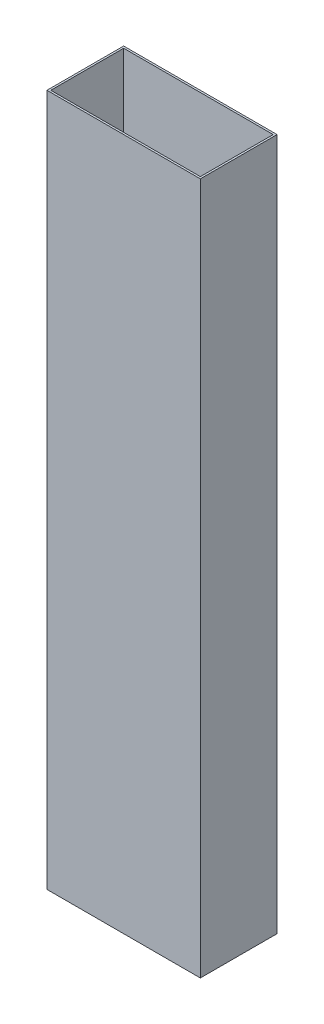
ISO-10303-21;
HEADER;
FILE_DESCRIPTION(('STEP AP214'),'2;1');
FILE_NAME('part.step','',(''),(''),'','','');
FILE_SCHEMA(('AUTOMOTIVE_DESIGN { 1 0 10303 214 1 1 1 1 }'));
ENDSEC;
DATA;
#1=APPLICATION_CONTEXT('core data for automotive mechanical design processes');
#2=APPLICATION_PROTOCOL_DEFINITION('international standard','automotive_design',2000,#1);
#3=PRODUCT_CONTEXT('',#1,'mechanical');
#4=PRODUCT('Part','Part','',(#3));
#5=PRODUCT_RELATED_PRODUCT_CATEGORY('part','',(#4));
#6=PRODUCT_DEFINITION_FORMATION('','',#4);
#7=PRODUCT_DEFINITION_CONTEXT('part definition',#1,'design');
#8=PRODUCT_DEFINITION('design','',#6,#7);
#9=PRODUCT_DEFINITION_SHAPE('','',#8);
#10=(LENGTH_UNIT() NAMED_UNIT(*) SI_UNIT(.MILLI.,.METRE.));
#11=(NAMED_UNIT(*) PLANE_ANGLE_UNIT() SI_UNIT($,.RADIAN.));
#12=(NAMED_UNIT(*) SI_UNIT($,.STERADIAN.) SOLID_ANGLE_UNIT());
#13=UNCERTAINTY_MEASURE_WITH_UNIT(LENGTH_MEASURE(1.E-05),#10,'distance_accuracy_value','');
#14=(GEOMETRIC_REPRESENTATION_CONTEXT(3) GLOBAL_UNCERTAINTY_ASSIGNED_CONTEXT((#13)) GLOBAL_UNIT_ASSIGNED_CONTEXT((#10,
#11,#12)) REPRESENTATION_CONTEXT('',''));
#15=CARTESIAN_POINT('',(0.,0.,0.));
#16=DIRECTION('',(0.,0.,1.));
#17=DIRECTION('',(1.,0.,0.));
#18=AXIS2_PLACEMENT_3D('',#15,#16,#17);
#19=CARTESIAN_POINT('',(99.06,-1526.54,-48.26));
#20=DIRECTION('',(0.,0.,-1.));
#21=DIRECTION('',(-1.,0.,0.));
#22=AXIS2_PLACEMENT_3D('',#19,#20,#21);
#23=PLANE('',#22);
#24=DIRECTION('',(0.,1.,0.));
#25=VECTOR('',#24,1.);
#26=CARTESIAN_POINT('',(-99.06,-1526.54,-48.26));
#27=LINE('',#26,#25);
#28=CARTESIAN_POINT('',(-99.06,-916.94,-48.26));
#29=VERTEX_POINT('',#28);
#30=CARTESIAN_POINT('',(-99.06,0.,-48.26));
#31=VERTEX_POINT('',#30);
#32=EDGE_CURVE('E140',#29,#31,#27,.T.);
#33=ORIENTED_EDGE('',*,*,#32,.F.);
#34=DIRECTION('',(-1.,0.,0.));
#35=VECTOR('',#34,1.);
#36=CARTESIAN_POINT('',(101.6,-916.94,-48.26));
#37=LINE('',#36,#35);
#38=CARTESIAN_POINT('',(99.06,-916.94,-48.26));
#39=VERTEX_POINT('',#38);
#40=EDGE_CURVE('E115',#39,#29,#37,.T.);
#41=ORIENTED_EDGE('',*,*,#40,.F.);
#42=DIRECTION('',(0.,1.,0.));
#43=VECTOR('',#42,1.);
#44=CARTESIAN_POINT('',(99.06,-1526.54,-48.26));
#45=LINE('',#44,#43);
#46=CARTESIAN_POINT('',(99.06,0.,-48.26));
#47=VERTEX_POINT('',#46);
#48=EDGE_CURVE('E145',#39,#47,#45,.T.);
#49=ORIENTED_EDGE('',*,*,#48,.T.);
#50=DIRECTION('',(-1.,0.,0.));
#51=VECTOR('',#50,1.);
#52=CARTESIAN_POINT('',(99.06,0.,-48.26));
#53=LINE('',#52,#51);
#54=EDGE_CURVE('E143',#47,#31,#53,.T.);
#55=ORIENTED_EDGE('',*,*,#54,.T.);
#56=EDGE_LOOP('',(#33,#41,#49,#55));
#57=FACE_BOUND('',#56,.T.);
#58=ADVANCED_FACE('F33',(#57),#23,.F.);
#59=CARTESIAN_POINT('',(-101.6,-1526.54,-50.8));
#60=DIRECTION('',(-1.,0.,0.));
#61=DIRECTION('',(0.,0.,1.));
#62=AXIS2_PLACEMENT_3D('',#59,#60,#61);
#63=PLANE('',#62);
#64=DIRECTION('',(0.,1.,0.));
#65=VECTOR('',#64,1.);
#66=CARTESIAN_POINT('',(-101.6,-1526.54,-50.8));
#67=LINE('',#66,#65);
#68=CARTESIAN_POINT('',(-101.6,-916.94,-50.8));
#69=VERTEX_POINT('',#68);
#70=CARTESIAN_POINT('',(-101.6,0.,-50.8));
#71=VERTEX_POINT('',#70);
#72=EDGE_CURVE('E41',#69,#71,#67,.T.);
#73=ORIENTED_EDGE('',*,*,#72,.F.);
#74=DIRECTION('',(0.,0.,1.));
#75=VECTOR('',#74,1.);
#76=CARTESIAN_POINT('',(-101.6,-916.94,50.8));
#77=LINE('',#76,#75);
#78=CARTESIAN_POINT('',(-101.6,-916.94,50.8));
#79=VERTEX_POINT('',#78);
#80=EDGE_CURVE('E107',#69,#79,#77,.T.);
#81=ORIENTED_EDGE('',*,*,#80,.T.);
#82=DIRECTION('',(0.,1.,0.));
#83=VECTOR('',#82,1.);
#84=CARTESIAN_POINT('',(-101.6,-1526.54,50.8));
#85=LINE('',#84,#83);
#86=CARTESIAN_POINT('',(-101.6,0.,50.8));
#87=VERTEX_POINT('',#86);
#88=EDGE_CURVE('E123',#79,#87,#85,.T.);
#89=ORIENTED_EDGE('',*,*,#88,.T.);
#90=DIRECTION('',(0.,0.,1.));
#91=VECTOR('',#90,1.);
#92=CARTESIAN_POINT('',(-101.6,0.,-50.8));
#93=LINE('',#92,#91);
#94=EDGE_CURVE('E138',#71,#87,#93,.T.);
#95=ORIENTED_EDGE('',*,*,#94,.F.);
#96=EDGE_LOOP('',(#73,#81,#89,#95));
#97=FACE_BOUND('',#96,.T.);
#98=ADVANCED_FACE('F35',(#97),#63,.T.);
#99=CARTESIAN_POINT('',(101.6,-1526.54,-50.8));
#100=DIRECTION('',(0.,0.,-1.));
#101=DIRECTION('',(-1.,0.,0.));
#102=AXIS2_PLACEMENT_3D('',#99,#100,#101);
#103=PLANE('',#102);
#104=DIRECTION('',(-1.,0.,0.));
#105=VECTOR('',#104,1.);
#106=CARTESIAN_POINT('',(101.6,-916.94,-50.8));
#107=LINE('',#106,#105);
#108=CARTESIAN_POINT('',(101.6,-916.94,-50.8));
#109=VERTEX_POINT('',#108);
#110=EDGE_CURVE('E108',#109,#69,#107,.T.);
#111=ORIENTED_EDGE('',*,*,#110,.T.);
#112=ORIENTED_EDGE('',*,*,#72,.T.);
#113=DIRECTION('',(-1.,0.,0.));
#114=VECTOR('',#113,1.);
#115=CARTESIAN_POINT('',(101.6,0.,-50.8));
#116=LINE('',#115,#114);
#117=CARTESIAN_POINT('',(101.6,0.,-50.8));
#118=VERTEX_POINT('',#117);
#119=EDGE_CURVE('E120',#118,#71,#116,.T.);
#120=ORIENTED_EDGE('',*,*,#119,.F.);
#121=DIRECTION('',(0.,1.,0.));
#122=VECTOR('',#121,1.);
#123=CARTESIAN_POINT('',(101.6,-1526.54,-50.8));
#124=LINE('',#123,#122);
#125=EDGE_CURVE('E102',#109,#118,#124,.T.);
#126=ORIENTED_EDGE('',*,*,#125,.F.);
#127=EDGE_LOOP('',(#111,#112,#120,#126));
#128=FACE_BOUND('',#127,.T.);
#129=ADVANCED_FACE('F118',(#128),#103,.T.);
#130=CARTESIAN_POINT('',(101.6,-1526.54,-50.8));
#131=DIRECTION('',(1.,0.,0.));
#132=DIRECTION('',(0.,0.,-1.));
#133=AXIS2_PLACEMENT_3D('',#130,#131,#132);
#134=PLANE('',#133);
#135=DIRECTION('',(0.,0.,1.));
#136=VECTOR('',#135,1.);
#137=CARTESIAN_POINT('',(101.6,-916.94,50.8));
#138=LINE('',#137,#136);
#139=CARTESIAN_POINT('',(101.6,-916.94,50.8));
#140=VERTEX_POINT('',#139);
#141=EDGE_CURVE('E97',#109,#140,#138,.T.);
#142=ORIENTED_EDGE('',*,*,#141,.F.);
#143=ORIENTED_EDGE('',*,*,#125,.T.);
#144=DIRECTION('',(0.,0.,-1.));
#145=VECTOR('',#144,1.);
#146=CARTESIAN_POINT('',(101.6,0.,-50.8));
#147=LINE('',#146,#145);
#148=CARTESIAN_POINT('',(101.6,0.,50.8));
#149=VERTEX_POINT('',#148);
#150=EDGE_CURVE('E130',#149,#118,#147,.T.);
#151=ORIENTED_EDGE('',*,*,#150,.F.);
#152=DIRECTION('',(0.,1.,0.));
#153=VECTOR('',#152,1.);
#154=CARTESIAN_POINT('',(101.6,-1526.54,50.8));
#155=LINE('',#154,#153);
#156=EDGE_CURVE('E104',#140,#149,#155,.T.);
#157=ORIENTED_EDGE('',*,*,#156,.F.);
#158=EDGE_LOOP('',(#142,#143,#151,#157));
#159=FACE_BOUND('',#158,.T.);
#160=ADVANCED_FACE('F99',(#159),#134,.T.);
#161=CARTESIAN_POINT('',(101.6,-1526.54,50.8));
#162=DIRECTION('',(0.,0.,1.));
#163=DIRECTION('',(1.,0.,0.));
#164=AXIS2_PLACEMENT_3D('',#161,#162,#163);
#165=PLANE('',#164);
#166=DIRECTION('',(1.,0.,0.));
#167=VECTOR('',#166,1.);
#168=CARTESIAN_POINT('',(-101.6,-916.94,50.8));
#169=LINE('',#168,#167);
#170=EDGE_CURVE('E161',#79,#140,#169,.T.);
#171=ORIENTED_EDGE('',*,*,#170,.T.);
#172=ORIENTED_EDGE('',*,*,#156,.T.);
#173=DIRECTION('',(1.,0.,0.));
#174=VECTOR('',#173,1.);
#175=CARTESIAN_POINT('',(101.6,0.,50.8));
#176=LINE('',#175,#174);
#177=EDGE_CURVE('E133',#87,#149,#176,.T.);
#178=ORIENTED_EDGE('',*,*,#177,.F.);
#179=ORIENTED_EDGE('',*,*,#88,.F.);
#180=EDGE_LOOP('',(#171,#172,#178,#179));
#181=FACE_BOUND('',#180,.T.);
#182=ADVANCED_FACE('F220',(#181),#165,.T.);
#183=CARTESIAN_POINT('',(0.,0.,0.));
#184=DIRECTION('',(0.,-1.,0.));
#185=DIRECTION('',(0.,0.,-1.));
#186=AXIS2_PLACEMENT_3D('',#183,#184,#185);
#187=PLANE('',#186);
#188=DIRECTION('',(1.,0.,0.));
#189=VECTOR('',#188,1.);
#190=CARTESIAN_POINT('',(99.06,0.,48.26));
#191=LINE('',#190,#189);
#192=CARTESIAN_POINT('',(-99.06,0.,48.26));
#193=VERTEX_POINT('',#192);
#194=CARTESIAN_POINT('',(99.06,0.,48.26));
#195=VERTEX_POINT('',#194);
#196=EDGE_CURVE('E153',#193,#195,#191,.T.);
#197=ORIENTED_EDGE('',*,*,#196,.F.);
#198=DIRECTION('',(0.,0.,1.));
#199=VECTOR('',#198,1.);
#200=CARTESIAN_POINT('',(-99.06,0.,48.26));
#201=LINE('',#200,#199);
#202=EDGE_CURVE('E155',#31,#193,#201,.T.);
#203=ORIENTED_EDGE('',*,*,#202,.F.);
#204=ORIENTED_EDGE('',*,*,#54,.F.);
#205=DIRECTION('',(0.,0.,-1.));
#206=VECTOR('',#205,1.);
#207=CARTESIAN_POINT('',(99.06,0.,48.26));
#208=LINE('',#207,#206);
#209=EDGE_CURVE('E150',#195,#47,#208,.T.);
#210=ORIENTED_EDGE('',*,*,#209,.F.);
#211=EDGE_LOOP('',(#197,#203,#204,#210));
#212=FACE_BOUND('',#211,.T.);
#213=ORIENTED_EDGE('',*,*,#94,.T.);
#214=ORIENTED_EDGE('',*,*,#177,.T.);
#215=ORIENTED_EDGE('',*,*,#150,.T.);
#216=ORIENTED_EDGE('',*,*,#119,.T.);
#217=EDGE_LOOP('',(#213,#214,#215,#216));
#218=FACE_BOUND('',#217,.T.);
#219=ADVANCED_FACE('F175',(#212,#218),#187,.F.);
#220=CARTESIAN_POINT('',(-99.06,-1526.54,48.26));
#221=DIRECTION('',(-1.,0.,0.));
#222=DIRECTION('',(0.,0.,1.));
#223=AXIS2_PLACEMENT_3D('',#220,#221,#222);
#224=PLANE('',#223);
#225=DIRECTION('',(0.,1.,0.));
#226=VECTOR('',#225,1.);
#227=CARTESIAN_POINT('',(-99.06,-1526.54,48.26));
#228=LINE('',#227,#226);
#229=CARTESIAN_POINT('',(-99.06,-916.94,48.26));
#230=VERTEX_POINT('',#229);
#231=EDGE_CURVE('E54',#230,#193,#228,.T.);
#232=ORIENTED_EDGE('',*,*,#231,.F.);
#233=DIRECTION('',(0.,0.,-1.));
#234=VECTOR('',#233,1.);
#235=CARTESIAN_POINT('',(-99.06,-916.94,48.26));
#236=LINE('',#235,#234);
#237=EDGE_CURVE('E48',#230,#29,#236,.T.);
#238=ORIENTED_EDGE('',*,*,#237,.T.);
#239=ORIENTED_EDGE('',*,*,#32,.T.);
#240=ORIENTED_EDGE('',*,*,#202,.T.);
#241=EDGE_LOOP('',(#232,#238,#239,#240));
#242=FACE_BOUND('',#241,.T.);
#243=ADVANCED_FACE('F169',(#242),#224,.F.);
#244=CARTESIAN_POINT('',(99.06,-1526.54,48.26));
#245=DIRECTION('',(1.,0.,0.));
#246=DIRECTION('',(0.,0.,-1.));
#247=AXIS2_PLACEMENT_3D('',#244,#245,#246);
#248=PLANE('',#247);
#249=ORIENTED_EDGE('',*,*,#48,.F.);
#250=DIRECTION('',(0.,0.,1.));
#251=VECTOR('',#250,1.);
#252=CARTESIAN_POINT('',(99.06,-916.94,48.26));
#253=LINE('',#252,#251);
#254=CARTESIAN_POINT('',(99.06,-916.94,48.26));
#255=VERTEX_POINT('',#254);
#256=EDGE_CURVE('E158',#39,#255,#253,.T.);
#257=ORIENTED_EDGE('',*,*,#256,.T.);
#258=DIRECTION('',(0.,1.,0.));
#259=VECTOR('',#258,1.);
#260=CARTESIAN_POINT('',(99.06,-1526.54,48.26));
#261=LINE('',#260,#259);
#262=EDGE_CURVE('E142',#255,#195,#261,.T.);
#263=ORIENTED_EDGE('',*,*,#262,.T.);
#264=ORIENTED_EDGE('',*,*,#209,.T.);
#265=EDGE_LOOP('',(#249,#257,#263,#264));
#266=FACE_BOUND('',#265,.T.);
#267=ADVANCED_FACE('F179',(#266),#248,.F.);
#268=CARTESIAN_POINT('',(99.06,-1526.54,48.26));
#269=DIRECTION('',(0.,0.,1.));
#270=DIRECTION('',(1.,0.,0.));
#271=AXIS2_PLACEMENT_3D('',#268,#269,#270);
#272=PLANE('',#271);
#273=ORIENTED_EDGE('',*,*,#262,.F.);
#274=DIRECTION('',(-1.,0.,0.));
#275=VECTOR('',#274,1.);
#276=CARTESIAN_POINT('',(99.06,-916.94,48.26));
#277=LINE('',#276,#275);
#278=EDGE_CURVE('E11',#255,#230,#277,.T.);
#279=ORIENTED_EDGE('',*,*,#278,.T.);
#280=ORIENTED_EDGE('',*,*,#231,.T.);
#281=ORIENTED_EDGE('',*,*,#196,.T.);
#282=EDGE_LOOP('',(#273,#279,#280,#281));
#283=FACE_BOUND('',#282,.T.);
#284=ADVANCED_FACE('F177',(#283),#272,.F.);
#285=CARTESIAN_POINT('',(-101.6,-916.94,50.8));
#286=DIRECTION('',(0.,1.,0.));
#287=DIRECTION('',(0.,0.,1.));
#288=AXIS2_PLACEMENT_3D('',#285,#286,#287);
#289=PLANE('',#288);
#290=ORIENTED_EDGE('',*,*,#40,.T.);
#291=ORIENTED_EDGE('',*,*,#237,.F.);
#292=ORIENTED_EDGE('',*,*,#278,.F.);
#293=ORIENTED_EDGE('',*,*,#256,.F.);
#294=EDGE_LOOP('',(#290,#291,#292,#293));
#295=FACE_BOUND('',#294,.T.);
#296=ORIENTED_EDGE('',*,*,#80,.F.);
#297=ORIENTED_EDGE('',*,*,#110,.F.);
#298=ORIENTED_EDGE('',*,*,#141,.T.);
#299=ORIENTED_EDGE('',*,*,#170,.F.);
#300=EDGE_LOOP('',(#296,#297,#298,#299));
#301=FACE_BOUND('',#300,.T.);
#302=ADVANCED_FACE('F111',(#295,#301),#289,.F.);
#303=CLOSED_SHELL('',(#58,#98,#129,#160,#182,#219,#243,#267,#284,#302));
#304=MANIFOLD_SOLID_BREP('B2',#303);
#305=ADVANCED_BREP_SHAPE_REPRESENTATION('',(#18,#304),#14);
#306=SHAPE_DEFINITION_REPRESENTATION(#9,#305);
ENDSEC;
END-ISO-10303-21;
